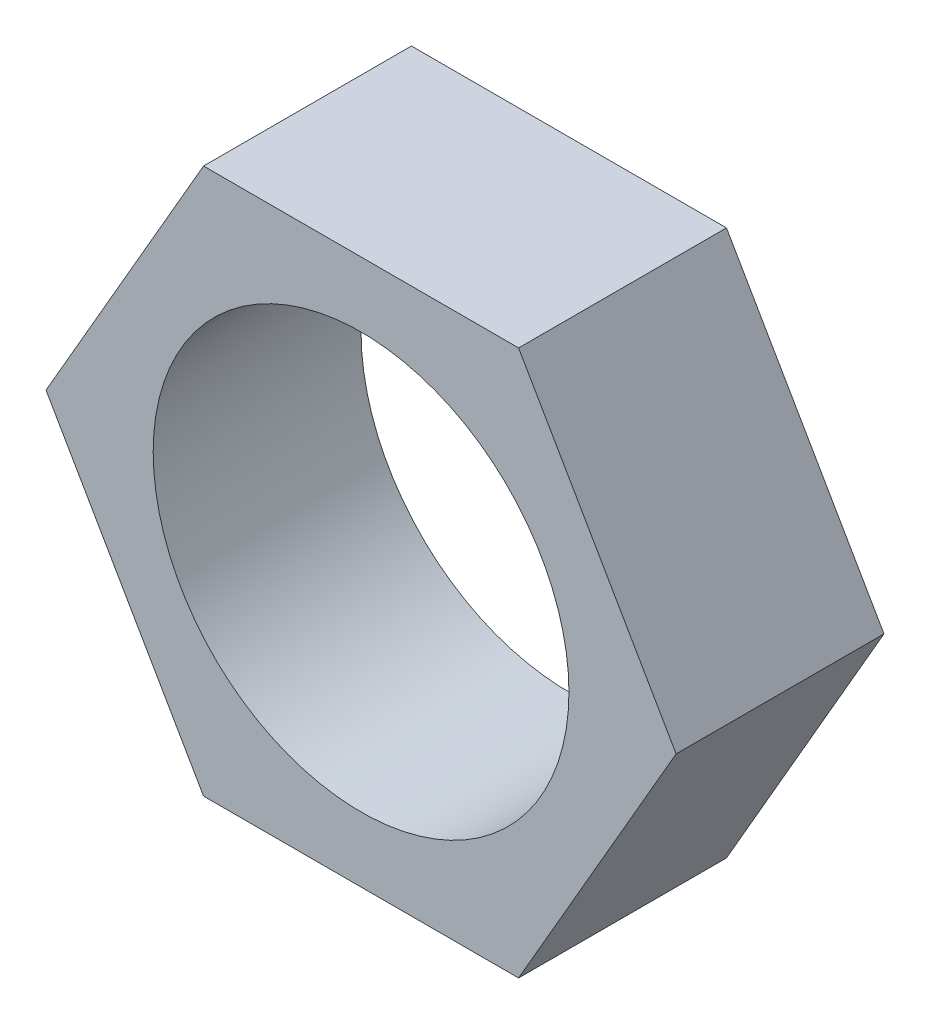
ISO-10303-21;
HEADER;
FILE_DESCRIPTION(('STEP AP214'),'2;1');
FILE_NAME('part.step','',(''),(''),'','','');
FILE_SCHEMA(('AUTOMOTIVE_DESIGN { 1 0 10303 214 1 1 1 1 }'));
ENDSEC;
DATA;
#1=APPLICATION_CONTEXT('core data for automotive mechanical design processes');
#2=APPLICATION_PROTOCOL_DEFINITION('international standard','automotive_design',2000,#1);
#3=PRODUCT_CONTEXT('',#1,'mechanical');
#4=PRODUCT('Part','Part','',(#3));
#5=PRODUCT_RELATED_PRODUCT_CATEGORY('part','',(#4));
#6=PRODUCT_DEFINITION_FORMATION('','',#4);
#7=PRODUCT_DEFINITION_CONTEXT('part definition',#1,'design');
#8=PRODUCT_DEFINITION('design','',#6,#7);
#9=PRODUCT_DEFINITION_SHAPE('','',#8);
#10=(LENGTH_UNIT() NAMED_UNIT(*) SI_UNIT(.MILLI.,.METRE.));
#11=(NAMED_UNIT(*) PLANE_ANGLE_UNIT() SI_UNIT($,.RADIAN.));
#12=(NAMED_UNIT(*) SI_UNIT($,.STERADIAN.) SOLID_ANGLE_UNIT());
#13=UNCERTAINTY_MEASURE_WITH_UNIT(LENGTH_MEASURE(1.E-05),#10,'distance_accuracy_value','');
#14=(GEOMETRIC_REPRESENTATION_CONTEXT(3) GLOBAL_UNCERTAINTY_ASSIGNED_CONTEXT((#13)) GLOBAL_UNIT_ASSIGNED_CONTEXT((#10,
#11,#12)) REPRESENTATION_CONTEXT('',''));
#15=CARTESIAN_POINT('',(0.,0.,0.));
#16=DIRECTION('',(0.,0.,1.));
#17=DIRECTION('',(1.,0.,0.));
#18=AXIS2_PLACEMENT_3D('',#15,#16,#17);
#19=CARTESIAN_POINT('',(0.,0.,12.7));
#20=DIRECTION('',(0.,0.,1.));
#21=DIRECTION('',(1.,0.,0.));
#22=AXIS2_PLACEMENT_3D('',#19,#20,#21);
#23=PLANE('',#22);
#24=DIRECTION('',(0.499999999999995,0.866025403784442,0.));
#25=VECTOR('',#24,1.);
#26=CARTESIAN_POINT('',(9.6237072995548,-16.6687499999999,12.7));
#27=LINE('',#26,#25);
#28=CARTESIAN_POINT('',(9.6237072995548,-16.6687499999999,12.7));
#29=VERTEX_POINT('',#28);
#30=CARTESIAN_POINT('',(19.2474145991092,0.,12.7));
#31=VERTEX_POINT('',#30);
#32=EDGE_CURVE('E129',#29,#31,#27,.T.);
#33=ORIENTED_EDGE('',*,*,#32,.T.);
#34=DIRECTION('',(-0.500000000000001,0.866025403784438,0.));
#35=VECTOR('',#34,1.);
#36=CARTESIAN_POINT('',(19.2474145991092,0.,12.7));
#37=LINE('',#36,#35);
#38=CARTESIAN_POINT('',(9.62370729955456,16.6687500000001,12.7));
#39=VERTEX_POINT('',#38);
#40=EDGE_CURVE('E87',#31,#39,#37,.T.);
#41=ORIENTED_EDGE('',*,*,#40,.T.);
#42=DIRECTION('',(-1.,0.,0.));
#43=VECTOR('',#42,1.);
#44=CARTESIAN_POINT('',(9.62370729955456,16.6687500000001,12.7));
#45=LINE('',#44,#43);
#46=CARTESIAN_POINT('',(-9.62370729955468,16.66875,12.7));
#47=VERTEX_POINT('',#46);
#48=EDGE_CURVE('E100',#39,#47,#45,.T.);
#49=ORIENTED_EDGE('',*,*,#48,.T.);
#50=DIRECTION('',(-0.499999999999995,-0.866025403784441,0.));
#51=VECTOR('',#50,1.);
#52=CARTESIAN_POINT('',(-9.62370729955468,16.66875,12.7));
#53=LINE('',#52,#51);
#54=CARTESIAN_POINT('',(-19.2474145991092,-1.34403977787533E-13,12.7));
#55=VERTEX_POINT('',#54);
#56=EDGE_CURVE('E94',#47,#55,#53,.T.);
#57=ORIENTED_EDGE('',*,*,#56,.T.);
#58=DIRECTION('',(0.500000000000007,-0.866025403784435,0.));
#59=VECTOR('',#58,1.);
#60=CARTESIAN_POINT('',(-19.2474145991092,-1.34403977787533E-13,12.7));
#61=LINE('',#60,#59);
#62=CARTESIAN_POINT('',(-9.62370729955445,-16.6687500000001,12.7));
#63=VERTEX_POINT('',#62);
#64=EDGE_CURVE('E98',#55,#63,#61,.T.);
#65=ORIENTED_EDGE('',*,*,#64,.T.);
#66=DIRECTION('',(1.,0.,0.));
#67=VECTOR('',#66,1.);
#68=CARTESIAN_POINT('',(-9.62370729955445,-16.6687500000001,12.7));
#69=LINE('',#68,#67);
#70=EDGE_CURVE('E50',#63,#29,#69,.T.);
#71=ORIENTED_EDGE('',*,*,#70,.T.);
#72=EDGE_LOOP('',(#33,#41,#49,#57,#65,#71));
#73=FACE_BOUND('',#72,.T.);
#74=CARTESIAN_POINT('',(0.,0.,12.7));
#75=DIRECTION('',(0.,0.,1.));
#76=DIRECTION('',(1.,0.,0.));
#77=AXIS2_PLACEMENT_3D('',#74,#75,#76);
#78=CIRCLE('',#77,12.7);
#79=CARTESIAN_POINT('',(12.7,0.,12.7));
#80=VERTEX_POINT('',#79);
#81=EDGE_CURVE('E122',#80,#80,#78,.T.);
#82=ORIENTED_EDGE('',*,*,#81,.F.);
#83=EDGE_LOOP('',(#82));
#84=FACE_BOUND('',#83,.T.);
#85=ADVANCED_FACE('F33',(#73,#84),#23,.T.);
#86=CARTESIAN_POINT('',(0.,0.,0.));
#87=DIRECTION('',(0.,0.,1.));
#88=DIRECTION('',(1.,0.,0.));
#89=AXIS2_PLACEMENT_3D('',#86,#87,#88);
#90=PLANE('',#89);
#91=DIRECTION('',(0.499999999999995,0.866025403784442,0.));
#92=VECTOR('',#91,1.);
#93=CARTESIAN_POINT('',(9.6237072995548,-16.6687499999999,0.));
#94=LINE('',#93,#92);
#95=CARTESIAN_POINT('',(9.6237072995548,-16.6687499999999,0.));
#96=VERTEX_POINT('',#95);
#97=CARTESIAN_POINT('',(19.2474145991092,0.,0.));
#98=VERTEX_POINT('',#97);
#99=EDGE_CURVE('E118',#96,#98,#94,.T.);
#100=ORIENTED_EDGE('',*,*,#99,.F.);
#101=DIRECTION('',(1.,0.,0.));
#102=VECTOR('',#101,1.);
#103=CARTESIAN_POINT('',(-9.62370729955445,-16.6687500000001,0.));
#104=LINE('',#103,#102);
#105=CARTESIAN_POINT('',(-9.62370729955445,-16.6687500000001,0.));
#106=VERTEX_POINT('',#105);
#107=EDGE_CURVE('E79',#106,#96,#104,.T.);
#108=ORIENTED_EDGE('',*,*,#107,.F.);
#109=DIRECTION('',(0.500000000000007,-0.866025403784435,0.));
#110=VECTOR('',#109,1.);
#111=CARTESIAN_POINT('',(-19.2474145991092,-1.34403977787533E-13,0.));
#112=LINE('',#111,#110);
#113=CARTESIAN_POINT('',(-19.2474145991092,-1.34403977787533E-13,0.));
#114=VERTEX_POINT('',#113);
#115=EDGE_CURVE('E73',#114,#106,#112,.T.);
#116=ORIENTED_EDGE('',*,*,#115,.F.);
#117=DIRECTION('',(-0.499999999999995,-0.866025403784441,0.));
#118=VECTOR('',#117,1.);
#119=CARTESIAN_POINT('',(-9.62370729955468,16.66875,0.));
#120=LINE('',#119,#118);
#121=CARTESIAN_POINT('',(-9.62370729955468,16.66875,0.));
#122=VERTEX_POINT('',#121);
#123=EDGE_CURVE('E108',#122,#114,#120,.T.);
#124=ORIENTED_EDGE('',*,*,#123,.F.);
#125=DIRECTION('',(-1.,0.,0.));
#126=VECTOR('',#125,1.);
#127=CARTESIAN_POINT('',(9.62370729955456,16.6687500000001,0.));
#128=LINE('',#127,#126);
#129=CARTESIAN_POINT('',(9.62370729955456,16.6687500000001,0.));
#130=VERTEX_POINT('',#129);
#131=EDGE_CURVE('E124',#130,#122,#128,.T.);
#132=ORIENTED_EDGE('',*,*,#131,.F.);
#133=DIRECTION('',(-0.500000000000001,0.866025403784438,0.));
#134=VECTOR('',#133,1.);
#135=CARTESIAN_POINT('',(19.2474145991092,0.,0.));
#136=LINE('',#135,#134);
#137=EDGE_CURVE('E121',#98,#130,#136,.T.);
#138=ORIENTED_EDGE('',*,*,#137,.F.);
#139=EDGE_LOOP('',(#100,#108,#116,#124,#132,#138));
#140=FACE_BOUND('',#139,.T.);
#141=CARTESIAN_POINT('',(0.,0.,0.));
#142=DIRECTION('',(0.,0.,1.));
#143=DIRECTION('',(1.,0.,0.));
#144=AXIS2_PLACEMENT_3D('',#141,#142,#143);
#145=CIRCLE('',#144,12.7);
#146=CARTESIAN_POINT('',(12.7,0.,0.));
#147=VERTEX_POINT('',#146);
#148=EDGE_CURVE('E222',#147,#147,#145,.T.);
#149=ORIENTED_EDGE('',*,*,#148,.T.);
#150=EDGE_LOOP('',(#149));
#151=FACE_BOUND('',#150,.T.);
#152=ADVANCED_FACE('F138',(#140,#151),#90,.F.);
#153=CARTESIAN_POINT('',(9.6237072995548,-16.6687499999999,12.7));
#154=DIRECTION('',(-0.866025403784441,0.499999999999995,0.));
#155=DIRECTION('',(-0.499999999999995,-0.866025403784442,0.));
#156=AXIS2_PLACEMENT_3D('',#153,#154,#155);
#157=PLANE('',#156);
#158=ORIENTED_EDGE('',*,*,#99,.T.);
#159=DIRECTION('',(0.,0.,-1.));
#160=VECTOR('',#159,1.);
#161=CARTESIAN_POINT('',(19.2474145991092,0.,12.7));
#162=LINE('',#161,#160);
#163=EDGE_CURVE('E11',#31,#98,#162,.T.);
#164=ORIENTED_EDGE('',*,*,#163,.F.);
#165=ORIENTED_EDGE('',*,*,#32,.F.);
#166=DIRECTION('',(0.,0.,-1.));
#167=VECTOR('',#166,1.);
#168=CARTESIAN_POINT('',(9.6237072995548,-16.6687499999999,12.7));
#169=LINE('',#168,#167);
#170=EDGE_CURVE('E114',#29,#96,#169,.T.);
#171=ORIENTED_EDGE('',*,*,#170,.T.);
#172=EDGE_LOOP('',(#158,#164,#165,#171));
#173=FACE_BOUND('',#172,.T.);
#174=ADVANCED_FACE('F35',(#173),#157,.F.);
#175=CARTESIAN_POINT('',(19.2474145991092,0.,12.7));
#176=DIRECTION('',(-0.866025403784438,-0.500000000000001,0.));
#177=DIRECTION('',(0.500000000000001,-0.866025403784438,0.));
#178=AXIS2_PLACEMENT_3D('',#175,#176,#177);
#179=PLANE('',#178);
#180=ORIENTED_EDGE('',*,*,#137,.T.);
#181=DIRECTION('',(0.,0.,-1.));
#182=VECTOR('',#181,1.);
#183=CARTESIAN_POINT('',(9.62370729955456,16.6687500000001,12.7));
#184=LINE('',#183,#182);
#185=EDGE_CURVE('E42',#39,#130,#184,.T.);
#186=ORIENTED_EDGE('',*,*,#185,.F.);
#187=ORIENTED_EDGE('',*,*,#40,.F.);
#188=ORIENTED_EDGE('',*,*,#163,.T.);
#189=EDGE_LOOP('',(#180,#186,#187,#188));
#190=FACE_BOUND('',#189,.T.);
#191=ADVANCED_FACE('F163',(#190),#179,.F.);
#192=CARTESIAN_POINT('',(9.62370729955456,16.6687500000001,12.7));
#193=DIRECTION('',(0.,-1.,0.));
#194=DIRECTION('',(1.,0.,0.));
#195=AXIS2_PLACEMENT_3D('',#192,#193,#194);
#196=PLANE('',#195);
#197=ORIENTED_EDGE('',*,*,#131,.T.);
#198=DIRECTION('',(0.,0.,-1.));
#199=VECTOR('',#198,1.);
#200=CARTESIAN_POINT('',(-9.62370729955468,16.66875,12.7));
#201=LINE('',#200,#199);
#202=EDGE_CURVE('E109',#47,#122,#201,.T.);
#203=ORIENTED_EDGE('',*,*,#202,.F.);
#204=ORIENTED_EDGE('',*,*,#48,.F.);
#205=ORIENTED_EDGE('',*,*,#185,.T.);
#206=EDGE_LOOP('',(#197,#203,#204,#205));
#207=FACE_BOUND('',#206,.T.);
#208=ADVANCED_FACE('F135',(#207),#196,.F.);
#209=CARTESIAN_POINT('',(-9.62370729955468,16.66875,12.7));
#210=DIRECTION('',(0.866025403784441,-0.499999999999995,0.));
#211=DIRECTION('',(0.499999999999995,0.866025403784442,0.));
#212=AXIS2_PLACEMENT_3D('',#209,#210,#211);
#213=PLANE('',#212);
#214=ORIENTED_EDGE('',*,*,#123,.T.);
#215=DIRECTION('',(0.,0.,-1.));
#216=VECTOR('',#215,1.);
#217=CARTESIAN_POINT('',(-19.2474145991092,-1.34403977787533E-13,12.7));
#218=LINE('',#217,#216);
#219=EDGE_CURVE('E105',#55,#114,#218,.T.);
#220=ORIENTED_EDGE('',*,*,#219,.F.);
#221=ORIENTED_EDGE('',*,*,#56,.F.);
#222=ORIENTED_EDGE('',*,*,#202,.T.);
#223=EDGE_LOOP('',(#214,#220,#221,#222));
#224=FACE_BOUND('',#223,.T.);
#225=ADVANCED_FACE('F106',(#224),#213,.F.);
#226=CARTESIAN_POINT('',(-19.2474145991092,-1.34403977787533E-13,12.7));
#227=DIRECTION('',(0.866025403784434,0.500000000000007,0.));
#228=DIRECTION('',(-0.500000000000007,0.866025403784435,0.));
#229=AXIS2_PLACEMENT_3D('',#226,#227,#228);
#230=PLANE('',#229);
#231=ORIENTED_EDGE('',*,*,#115,.T.);
#232=DIRECTION('',(0.,0.,-1.));
#233=VECTOR('',#232,1.);
#234=CARTESIAN_POINT('',(-9.62370729955445,-16.6687500000001,12.7));
#235=LINE('',#234,#233);
#236=EDGE_CURVE('E110',#63,#106,#235,.T.);
#237=ORIENTED_EDGE('',*,*,#236,.F.);
#238=ORIENTED_EDGE('',*,*,#64,.F.);
#239=ORIENTED_EDGE('',*,*,#219,.T.);
#240=EDGE_LOOP('',(#231,#237,#238,#239));
#241=FACE_BOUND('',#240,.T.);
#242=ADVANCED_FACE('F112',(#241),#230,.F.);
#243=CARTESIAN_POINT('',(-9.62370729955445,-16.6687500000001,12.7));
#244=DIRECTION('',(0.,1.,0.));
#245=DIRECTION('',(-1.,0.,0.));
#246=AXIS2_PLACEMENT_3D('',#243,#244,#245);
#247=PLANE('',#246);
#248=ORIENTED_EDGE('',*,*,#107,.T.);
#249=ORIENTED_EDGE('',*,*,#170,.F.);
#250=ORIENTED_EDGE('',*,*,#70,.F.);
#251=ORIENTED_EDGE('',*,*,#236,.T.);
#252=EDGE_LOOP('',(#248,#249,#250,#251));
#253=FACE_BOUND('',#252,.T.);
#254=ADVANCED_FACE('F143',(#253),#247,.F.);
#255=CARTESIAN_POINT('',(0.,0.,12.7));
#256=DIRECTION('',(0.,0.,-1.));
#257=DIRECTION('',(-1.,0.,0.));
#258=AXIS2_PLACEMENT_3D('',#255,#256,#257);
#259=CYLINDRICAL_SURFACE('',#258,12.7);
#260=ORIENTED_EDGE('',*,*,#81,.T.);
#261=EDGE_LOOP('',(#260));
#262=FACE_BOUND('',#261,.T.);
#263=ORIENTED_EDGE('',*,*,#148,.F.);
#264=EDGE_LOOP('',(#263));
#265=FACE_BOUND('',#264,.T.);
#266=ADVANCED_FACE('F145',(#262,#265),#259,.F.);
#267=CLOSED_SHELL('',(#85,#152,#174,#191,#208,#225,#242,#254,#266));
#268=MANIFOLD_SOLID_BREP('B2',#267);
#269=ADVANCED_BREP_SHAPE_REPRESENTATION('',(#18,#268),#14);
#270=SHAPE_DEFINITION_REPRESENTATION(#9,#269);
ENDSEC;
END-ISO-10303-21;
